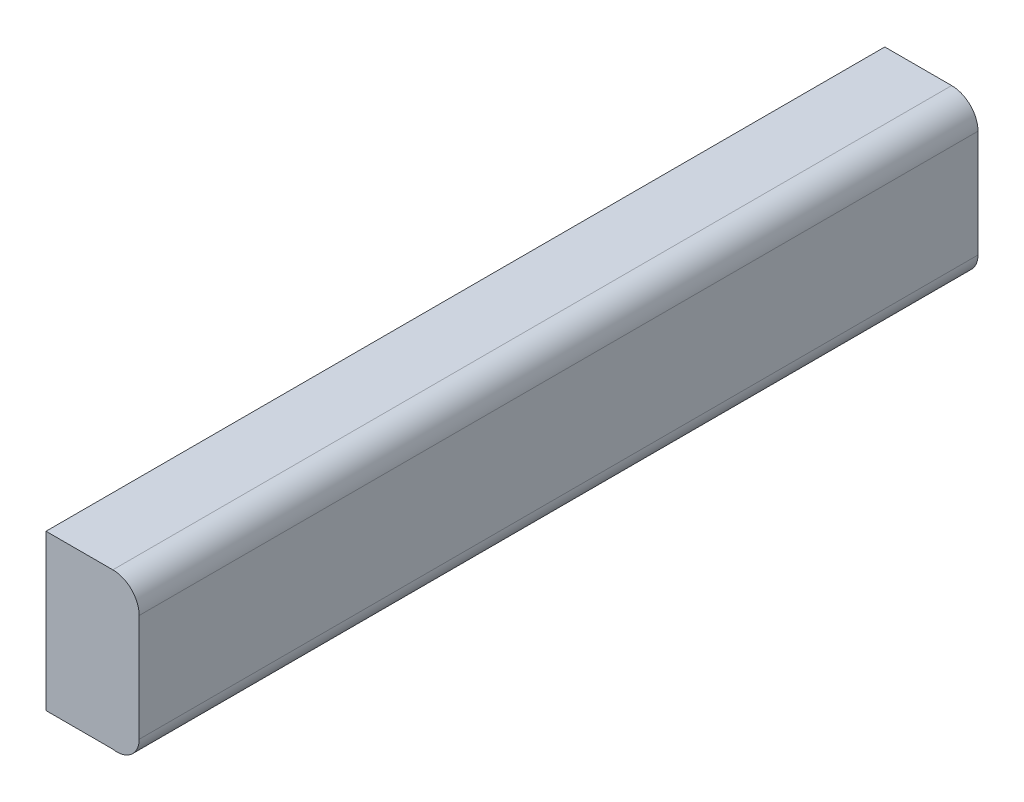
ISO-10303-21;
HEADER;
FILE_DESCRIPTION(('STEP AP214'),'2;1');
FILE_NAME('part.step','',(''),(''),'','','');
FILE_SCHEMA(('AUTOMOTIVE_DESIGN { 1 0 10303 214 1 1 1 1 }'));
ENDSEC;
DATA;
#1=APPLICATION_CONTEXT('core data for automotive mechanical design processes');
#2=APPLICATION_PROTOCOL_DEFINITION('international standard','automotive_design',2000,#1);
#3=PRODUCT_CONTEXT('',#1,'mechanical');
#4=PRODUCT('Part','Part','',(#3));
#5=PRODUCT_RELATED_PRODUCT_CATEGORY('part','',(#4));
#6=PRODUCT_DEFINITION_FORMATION('','',#4);
#7=PRODUCT_DEFINITION_CONTEXT('part definition',#1,'design');
#8=PRODUCT_DEFINITION('design','',#6,#7);
#9=PRODUCT_DEFINITION_SHAPE('','',#8);
#10=(LENGTH_UNIT() NAMED_UNIT(*) SI_UNIT(.MILLI.,.METRE.));
#11=(NAMED_UNIT(*) PLANE_ANGLE_UNIT() SI_UNIT($,.RADIAN.));
#12=(NAMED_UNIT(*) SI_UNIT($,.STERADIAN.) SOLID_ANGLE_UNIT());
#13=UNCERTAINTY_MEASURE_WITH_UNIT(LENGTH_MEASURE(1.E-05),#10,'distance_accuracy_value','');
#14=(GEOMETRIC_REPRESENTATION_CONTEXT(3) GLOBAL_UNCERTAINTY_ASSIGNED_CONTEXT((#13)) GLOBAL_UNIT_ASSIGNED_CONTEXT((#10,
#11,#12)) REPRESENTATION_CONTEXT('',''));
#15=CARTESIAN_POINT('',(0.,0.,0.));
#16=DIRECTION('',(0.,0.,1.));
#17=DIRECTION('',(1.,0.,0.));
#18=AXIS2_PLACEMENT_3D('',#15,#16,#17);
#19=CARTESIAN_POINT('',(0.,-127.,685.8));
#20=DIRECTION('',(1.,0.,0.));
#21=DIRECTION('',(0.,0.,-1.));
#22=AXIS2_PLACEMENT_3D('',#19,#20,#21);
#23=PLANE('',#22);
#24=DIRECTION('',(0.,-1.,0.));
#25=VECTOR('',#24,1.);
#26=CARTESIAN_POINT('',(0.,-127.,0.));
#27=LINE('',#26,#25);
#28=CARTESIAN_POINT('',(0.,0.,0.));
#29=VERTEX_POINT('',#28);
#30=CARTESIAN_POINT('',(0.,-127.,0.));
#31=VERTEX_POINT('',#30);
#32=EDGE_CURVE('E117',#29,#31,#27,.T.);
#33=ORIENTED_EDGE('',*,*,#32,.T.);
#34=DIRECTION('',(0.,0.,-1.));
#35=VECTOR('',#34,1.);
#36=CARTESIAN_POINT('',(0.,-127.,685.8));
#37=LINE('',#36,#35);
#38=CARTESIAN_POINT('',(0.,-127.,685.8));
#39=VERTEX_POINT('',#38);
#40=EDGE_CURVE('E11',#39,#31,#37,.T.);
#41=ORIENTED_EDGE('',*,*,#40,.F.);
#42=DIRECTION('',(0.,-1.,0.));
#43=VECTOR('',#42,1.);
#44=CARTESIAN_POINT('',(0.,-127.,685.8));
#45=LINE('',#44,#43);
#46=CARTESIAN_POINT('',(0.,0.,685.8));
#47=VERTEX_POINT('',#46);
#48=EDGE_CURVE('E127',#47,#39,#45,.T.);
#49=ORIENTED_EDGE('',*,*,#48,.F.);
#50=DIRECTION('',(0.,0.,-1.));
#51=VECTOR('',#50,1.);
#52=CARTESIAN_POINT('',(0.,0.,685.8));
#53=LINE('',#52,#51);
#54=EDGE_CURVE('E113',#47,#29,#53,.T.);
#55=ORIENTED_EDGE('',*,*,#54,.T.);
#56=EDGE_LOOP('',(#33,#41,#49,#55));
#57=FACE_BOUND('',#56,.T.);
#58=ADVANCED_FACE('F33',(#57),#23,.F.);
#59=CARTESIAN_POINT('',(54.6563521757354,-127.,685.8));
#60=DIRECTION('',(0.,1.,0.));
#61=DIRECTION('',(0.,0.,1.));
#62=AXIS2_PLACEMENT_3D('',#59,#60,#61);
#63=PLANE('',#62);
#64=DIRECTION('',(1.,0.,0.));
#65=VECTOR('',#64,1.);
#66=CARTESIAN_POINT('',(54.6563521757354,-127.,0.));
#67=LINE('',#66,#65);
#68=CARTESIAN_POINT('',(54.6563521757354,-127.,0.));
#69=VERTEX_POINT('',#68);
#70=EDGE_CURVE('E120',#31,#69,#67,.T.);
#71=ORIENTED_EDGE('',*,*,#70,.T.);
#72=DIRECTION('',(0.,0.,-1.));
#73=VECTOR('',#72,1.);
#74=CARTESIAN_POINT('',(54.6563521757354,-127.,685.8));
#75=LINE('',#74,#73);
#76=CARTESIAN_POINT('',(54.6563521757354,-127.,685.8));
#77=VERTEX_POINT('',#76);
#78=EDGE_CURVE('E41',#77,#69,#75,.T.);
#79=ORIENTED_EDGE('',*,*,#78,.F.);
#80=DIRECTION('',(1.,0.,0.));
#81=VECTOR('',#80,1.);
#82=CARTESIAN_POINT('',(54.6563521757354,-127.,685.8));
#83=LINE('',#82,#81);
#84=EDGE_CURVE('E86',#39,#77,#83,.T.);
#85=ORIENTED_EDGE('',*,*,#84,.F.);
#86=ORIENTED_EDGE('',*,*,#40,.T.);
#87=EDGE_LOOP('',(#71,#79,#85,#86));
#88=FACE_BOUND('',#87,.T.);
#89=ADVANCED_FACE('F151',(#88),#63,.F.);
#90=CARTESIAN_POINT('',(58.0678356013673,-109.191654579505,685.8));
#91=DIRECTION('',(0.,0.,-1.));
#92=DIRECTION('',(-1.,0.,0.));
#93=AXIS2_PLACEMENT_3D('',#90,#91,#92);
#94=CYLINDRICAL_SURFACE('',#93,18.1321643986327);
#95=CARTESIAN_POINT('',(58.0678356013673,-109.191654579505,0.));
#96=DIRECTION('',(0.,0.,1.));
#97=DIRECTION('',(-1.,0.,0.));
#98=AXIS2_PLACEMENT_3D('',#95,#96,#97);
#99=CIRCLE('',#98,18.1321643986327);
#100=CARTESIAN_POINT('',(76.2,-109.191654579505,0.));
#101=VERTEX_POINT('',#100);
#102=EDGE_CURVE('E122',#69,#101,#99,.T.);
#103=ORIENTED_EDGE('',*,*,#102,.T.);
#104=DIRECTION('',(0.,0.,-1.));
#105=VECTOR('',#104,1.);
#106=CARTESIAN_POINT('',(76.2,-109.191654579505,685.8));
#107=LINE('',#106,#105);
#108=CARTESIAN_POINT('',(76.2,-109.191654579505,685.8));
#109=VERTEX_POINT('',#108);
#110=EDGE_CURVE('E108',#109,#101,#107,.T.);
#111=ORIENTED_EDGE('',*,*,#110,.F.);
#112=CARTESIAN_POINT('',(58.0678356013673,-109.191654579505,685.8));
#113=DIRECTION('',(0.,0.,1.));
#114=DIRECTION('',(-1.,0.,0.));
#115=AXIS2_PLACEMENT_3D('',#112,#113,#114);
#116=CIRCLE('',#115,18.1321643986327);
#117=EDGE_CURVE('E99',#77,#109,#116,.T.);
#118=ORIENTED_EDGE('',*,*,#117,.F.);
#119=ORIENTED_EDGE('',*,*,#78,.T.);
#120=EDGE_LOOP('',(#103,#111,#118,#119));
#121=FACE_BOUND('',#120,.T.);
#122=ADVANCED_FACE('F133',(#121),#94,.T.);
#123=CARTESIAN_POINT('',(76.2,-21.5436478242646,685.8));
#124=DIRECTION('',(-1.,0.,0.));
#125=DIRECTION('',(0.,-1.,0.));
#126=AXIS2_PLACEMENT_3D('',#123,#124,#125);
#127=PLANE('',#126);
#128=DIRECTION('',(0.,1.,0.));
#129=VECTOR('',#128,1.);
#130=CARTESIAN_POINT('',(76.2,-21.5436478242646,0.));
#131=LINE('',#130,#129);
#132=CARTESIAN_POINT('',(76.2,-21.5436478242646,0.));
#133=VERTEX_POINT('',#132);
#134=EDGE_CURVE('E107',#101,#133,#131,.T.);
#135=ORIENTED_EDGE('',*,*,#134,.T.);
#136=DIRECTION('',(0.,0.,-1.));
#137=VECTOR('',#136,1.);
#138=CARTESIAN_POINT('',(76.2,-21.5436478242646,685.8));
#139=LINE('',#138,#137);
#140=CARTESIAN_POINT('',(76.2,-21.5436478242646,685.8));
#141=VERTEX_POINT('',#140);
#142=EDGE_CURVE('E104',#141,#133,#139,.T.);
#143=ORIENTED_EDGE('',*,*,#142,.F.);
#144=DIRECTION('',(0.,1.,0.));
#145=VECTOR('',#144,1.);
#146=CARTESIAN_POINT('',(76.2,-21.5436478242646,685.8));
#147=LINE('',#146,#145);
#148=EDGE_CURVE('E93',#109,#141,#147,.T.);
#149=ORIENTED_EDGE('',*,*,#148,.F.);
#150=ORIENTED_EDGE('',*,*,#110,.T.);
#151=EDGE_LOOP('',(#135,#143,#149,#150));
#152=FACE_BOUND('',#151,.T.);
#153=ADVANCED_FACE('F105',(#152),#127,.F.);
#154=CARTESIAN_POINT('',(54.6563521757354,-21.5436478242646,685.8));
#155=DIRECTION('',(0.,0.,-1.));
#156=DIRECTION('',(-1.,0.,0.));
#157=AXIS2_PLACEMENT_3D('',#154,#155,#156);
#158=CYLINDRICAL_SURFACE('',#157,21.5436478242646);
#159=CARTESIAN_POINT('',(54.6563521757354,-21.5436478242646,0.));
#160=DIRECTION('',(0.,0.,1.));
#161=DIRECTION('',(-1.,0.,0.));
#162=AXIS2_PLACEMENT_3D('',#159,#160,#161);
#163=CIRCLE('',#162,21.5436478242646);
#164=CARTESIAN_POINT('',(54.6563521757354,0.,0.));
#165=VERTEX_POINT('',#164);
#166=EDGE_CURVE('E72',#133,#165,#163,.T.);
#167=ORIENTED_EDGE('',*,*,#166,.T.);
#168=DIRECTION('',(0.,0.,-1.));
#169=VECTOR('',#168,1.);
#170=CARTESIAN_POINT('',(54.6563521757354,0.,685.8));
#171=LINE('',#170,#169);
#172=CARTESIAN_POINT('',(54.6563521757354,0.,685.8));
#173=VERTEX_POINT('',#172);
#174=EDGE_CURVE('E109',#173,#165,#171,.T.);
#175=ORIENTED_EDGE('',*,*,#174,.F.);
#176=CARTESIAN_POINT('',(54.6563521757354,-21.5436478242646,685.8));
#177=DIRECTION('',(0.,0.,1.));
#178=DIRECTION('',(-1.,0.,0.));
#179=AXIS2_PLACEMENT_3D('',#176,#177,#178);
#180=CIRCLE('',#179,21.5436478242646);
#181=EDGE_CURVE('E97',#141,#173,#180,.T.);
#182=ORIENTED_EDGE('',*,*,#181,.F.);
#183=ORIENTED_EDGE('',*,*,#142,.T.);
#184=EDGE_LOOP('',(#167,#175,#182,#183));
#185=FACE_BOUND('',#184,.T.);
#186=ADVANCED_FACE('F111',(#185),#158,.T.);
#187=CARTESIAN_POINT('',(0.,0.,685.8));
#188=DIRECTION('',(0.,-1.,0.));
#189=DIRECTION('',(0.,0.,-1.));
#190=AXIS2_PLACEMENT_3D('',#187,#188,#189);
#191=PLANE('',#190);
#192=DIRECTION('',(-1.,0.,0.));
#193=VECTOR('',#192,1.);
#194=CARTESIAN_POINT('',(0.,0.,0.));
#195=LINE('',#194,#193);
#196=EDGE_CURVE('E78',#165,#29,#195,.T.);
#197=ORIENTED_EDGE('',*,*,#196,.T.);
#198=ORIENTED_EDGE('',*,*,#54,.F.);
#199=DIRECTION('',(-1.,0.,0.));
#200=VECTOR('',#199,1.);
#201=CARTESIAN_POINT('',(0.,0.,685.8));
#202=LINE('',#201,#200);
#203=EDGE_CURVE('E49',#173,#47,#202,.T.);
#204=ORIENTED_EDGE('',*,*,#203,.F.);
#205=ORIENTED_EDGE('',*,*,#174,.T.);
#206=EDGE_LOOP('',(#197,#198,#204,#205));
#207=FACE_BOUND('',#206,.T.);
#208=ADVANCED_FACE('F140',(#207),#191,.F.);
#209=CARTESIAN_POINT('',(54.6563521757354,-21.5436478242646,685.8));
#210=DIRECTION('',(0.,0.,-1.));
#211=DIRECTION('',(-1.,0.,0.));
#212=AXIS2_PLACEMENT_3D('',#209,#210,#211);
#213=PLANE('',#212);
#214=ORIENTED_EDGE('',*,*,#48,.T.);
#215=ORIENTED_EDGE('',*,*,#84,.T.);
#216=ORIENTED_EDGE('',*,*,#117,.T.);
#217=ORIENTED_EDGE('',*,*,#148,.T.);
#218=ORIENTED_EDGE('',*,*,#181,.T.);
#219=ORIENTED_EDGE('',*,*,#203,.T.);
#220=EDGE_LOOP('',(#214,#215,#216,#217,#218,#219));
#221=FACE_BOUND('',#220,.T.);
#222=ADVANCED_FACE('F95',(#221),#213,.F.);
#223=CARTESIAN_POINT('',(54.6563521757354,-21.5436478242646,0.));
#224=DIRECTION('',(0.,0.,-1.));
#225=DIRECTION('',(-1.,0.,0.));
#226=AXIS2_PLACEMENT_3D('',#223,#224,#225);
#227=PLANE('',#226);
#228=ORIENTED_EDGE('',*,*,#32,.F.);
#229=ORIENTED_EDGE('',*,*,#196,.F.);
#230=ORIENTED_EDGE('',*,*,#166,.F.);
#231=ORIENTED_EDGE('',*,*,#134,.F.);
#232=ORIENTED_EDGE('',*,*,#102,.F.);
#233=ORIENTED_EDGE('',*,*,#70,.F.);
#234=EDGE_LOOP('',(#228,#229,#230,#231,#232,#233));
#235=FACE_BOUND('',#234,.T.);
#236=ADVANCED_FACE('F136',(#235),#227,.T.);
#237=CLOSED_SHELL('',(#58,#89,#122,#153,#186,#208,#222,#236));
#238=MANIFOLD_SOLID_BREP('B2',#237);
#239=ADVANCED_BREP_SHAPE_REPRESENTATION('',(#18,#238),#14);
#240=SHAPE_DEFINITION_REPRESENTATION(#9,#239);
ENDSEC;
END-ISO-10303-21;
